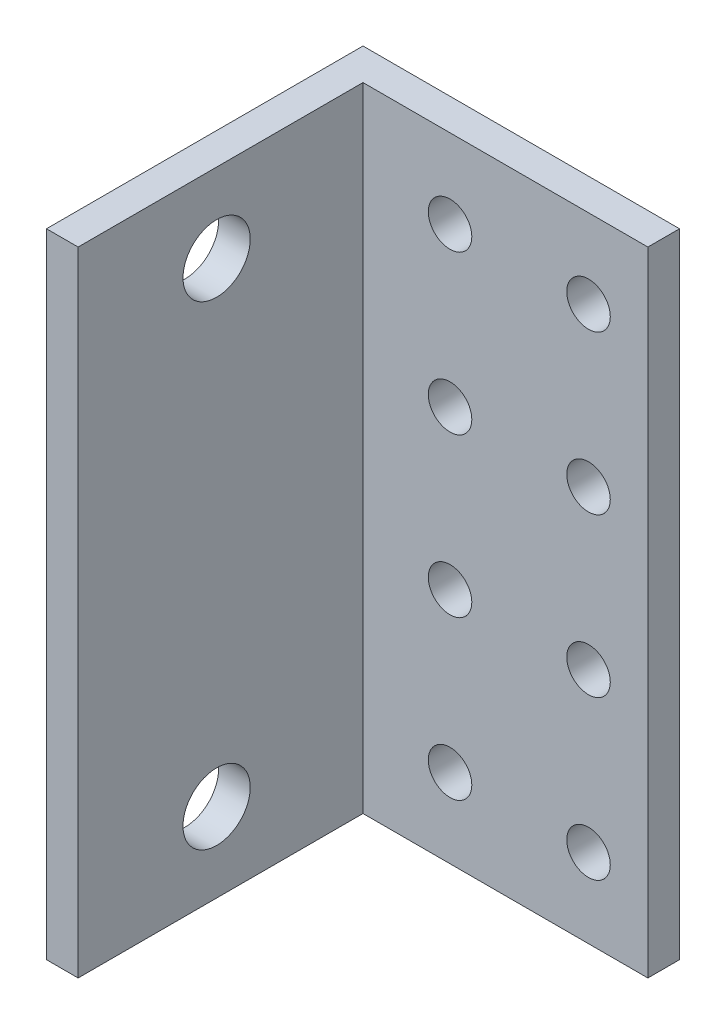
ISO-10303-21;
HEADER;
FILE_DESCRIPTION(('STEP AP214'),'2;1');
FILE_NAME('part.step','',(''),(''),'','','');
FILE_SCHEMA(('AUTOMOTIVE_DESIGN { 1 0 10303 214 1 1 1 1 }'));
ENDSEC;
DATA;
#1=APPLICATION_CONTEXT('core data for automotive mechanical design processes');
#2=APPLICATION_PROTOCOL_DEFINITION('international standard','automotive_design',2000,#1);
#3=PRODUCT_CONTEXT('',#1,'mechanical');
#4=PRODUCT('Part','Part','',(#3));
#5=PRODUCT_RELATED_PRODUCT_CATEGORY('part','',(#4));
#6=PRODUCT_DEFINITION_FORMATION('','',#4);
#7=PRODUCT_DEFINITION_CONTEXT('part definition',#1,'design');
#8=PRODUCT_DEFINITION('design','',#6,#7);
#9=PRODUCT_DEFINITION_SHAPE('','',#8);
#10=(LENGTH_UNIT() NAMED_UNIT(*) SI_UNIT(.MILLI.,.METRE.));
#11=(NAMED_UNIT(*) PLANE_ANGLE_UNIT() SI_UNIT($,.RADIAN.));
#12=(NAMED_UNIT(*) SI_UNIT($,.STERADIAN.) SOLID_ANGLE_UNIT());
#13=UNCERTAINTY_MEASURE_WITH_UNIT(LENGTH_MEASURE(1.E-05),#10,'distance_accuracy_value','');
#14=(GEOMETRIC_REPRESENTATION_CONTEXT(3) GLOBAL_UNCERTAINTY_ASSIGNED_CONTEXT((#13)) GLOBAL_UNIT_ASSIGNED_CONTEXT((#10,
#11,#12)) REPRESENTATION_CONTEXT('',''));
#15=CARTESIAN_POINT('',(0.,0.,0.));
#16=DIRECTION('',(0.,0.,1.));
#17=DIRECTION('',(1.,0.,0.));
#18=AXIS2_PLACEMENT_3D('',#15,#16,#17);
#19=CARTESIAN_POINT('',(4.,80.,4.));
#20=DIRECTION('',(-1.,0.,0.));
#21=DIRECTION('',(0.,0.,1.));
#22=AXIS2_PLACEMENT_3D('',#19,#20,#21);
#23=PLANE('',#22);
#24=DIRECTION('',(0.,0.,-1.));
#25=VECTOR('',#24,1.);
#26=CARTESIAN_POINT('',(4.,0.,4.));
#27=LINE('',#26,#25);
#28=CARTESIAN_POINT('',(4.,0.,40.));
#29=VERTEX_POINT('',#28);
#30=CARTESIAN_POINT('',(4.,0.,4.));
#31=VERTEX_POINT('',#30);
#32=EDGE_CURVE('E126',#29,#31,#27,.T.);
#33=ORIENTED_EDGE('',*,*,#32,.T.);
#34=DIRECTION('',(0.,-1.,0.));
#35=VECTOR('',#34,1.);
#36=CARTESIAN_POINT('',(4.,80.,4.));
#37=LINE('',#36,#35);
#38=CARTESIAN_POINT('',(4.,80.,4.));
#39=VERTEX_POINT('',#38);
#40=EDGE_CURVE('E111',#39,#31,#37,.T.);
#41=ORIENTED_EDGE('',*,*,#40,.F.);
#42=DIRECTION('',(0.,0.,-1.));
#43=VECTOR('',#42,1.);
#44=CARTESIAN_POINT('',(4.,80.,4.));
#45=LINE('',#44,#43);
#46=CARTESIAN_POINT('',(4.,80.,40.));
#47=VERTEX_POINT('',#46);
#48=EDGE_CURVE('E101',#47,#39,#45,.T.);
#49=ORIENTED_EDGE('',*,*,#48,.F.);
#50=DIRECTION('',(0.,-1.,0.));
#51=VECTOR('',#50,1.);
#52=CARTESIAN_POINT('',(4.,80.,40.));
#53=LINE('',#52,#51);
#54=EDGE_CURVE('E43',#47,#29,#53,.T.);
#55=ORIENTED_EDGE('',*,*,#54,.T.);
#56=EDGE_LOOP('',(#33,#41,#49,#55));
#57=FACE_BOUND('',#56,.T.);
#58=CARTESIAN_POINT('',(4.,9.99999999999999,22.5));
#59=DIRECTION('',(1.,0.,0.));
#60=DIRECTION('',(0.,0.,-1.));
#61=AXIS2_PLACEMENT_3D('',#58,#59,#60);
#62=CIRCLE('',#61,4.25);
#63=CARTESIAN_POINT('',(4.,9.99999999999999,18.25));
#64=VERTEX_POINT('',#63);
#65=EDGE_CURVE('E181',#64,#64,#62,.T.);
#66=ORIENTED_EDGE('',*,*,#65,.F.);
#67=EDGE_LOOP('',(#66));
#68=FACE_BOUND('',#67,.T.);
#69=CARTESIAN_POINT('',(4.,70.,22.5));
#70=DIRECTION('',(1.,0.,0.));
#71=DIRECTION('',(0.,0.,-1.));
#72=AXIS2_PLACEMENT_3D('',#69,#70,#71);
#73=CIRCLE('',#72,4.25);
#74=CARTESIAN_POINT('',(4.,70.,18.25));
#75=VERTEX_POINT('',#74);
#76=EDGE_CURVE('E392',#75,#75,#73,.T.);
#77=ORIENTED_EDGE('',*,*,#76,.F.);
#78=EDGE_LOOP('',(#77));
#79=FACE_BOUND('',#78,.T.);
#80=ADVANCED_FACE('F34',(#57,#68,#79),#23,.F.);
#81=CARTESIAN_POINT('',(40.,80.,4.));
#82=DIRECTION('',(0.,0.,-1.));
#83=DIRECTION('',(-1.,0.,0.));
#84=AXIS2_PLACEMENT_3D('',#81,#82,#83);
#85=PLANE('',#84);
#86=CARTESIAN_POINT('',(32.5,70.,4.));
#87=DIRECTION('',(0.,0.,1.));
#88=DIRECTION('',(1.,0.,0.));
#89=AXIS2_PLACEMENT_3D('',#86,#87,#88);
#90=CIRCLE('',#89,2.75);
#91=CARTESIAN_POINT('',(35.25,70.,4.));
#92=VERTEX_POINT('',#91);
#93=EDGE_CURVE('E180',#92,#92,#90,.T.);
#94=ORIENTED_EDGE('',*,*,#93,.F.);
#95=EDGE_LOOP('',(#94));
#96=FACE_BOUND('',#95,.T.);
#97=CARTESIAN_POINT('',(15.,70.,4.));
#98=DIRECTION('',(0.,0.,1.));
#99=DIRECTION('',(1.,0.,0.));
#100=AXIS2_PLACEMENT_3D('',#97,#98,#99);
#101=CIRCLE('',#100,2.75);
#102=CARTESIAN_POINT('',(17.75,70.,4.));
#103=VERTEX_POINT('',#102);
#104=EDGE_CURVE('E191',#103,#103,#101,.T.);
#105=ORIENTED_EDGE('',*,*,#104,.F.);
#106=EDGE_LOOP('',(#105));
#107=FACE_BOUND('',#106,.T.);
#108=DIRECTION('',(1.,0.,0.));
#109=VECTOR('',#108,1.);
#110=CARTESIAN_POINT('',(40.,0.,4.));
#111=LINE('',#110,#109);
#112=CARTESIAN_POINT('',(40.,0.,4.));
#113=VERTEX_POINT('',#112);
#114=EDGE_CURVE('E110',#31,#113,#111,.T.);
#115=ORIENTED_EDGE('',*,*,#114,.T.);
#116=DIRECTION('',(0.,-1.,0.));
#117=VECTOR('',#116,1.);
#118=CARTESIAN_POINT('',(40.,80.,4.));
#119=LINE('',#118,#117);
#120=CARTESIAN_POINT('',(40.,80.,4.));
#121=VERTEX_POINT('',#120);
#122=EDGE_CURVE('E106',#121,#113,#119,.T.);
#123=ORIENTED_EDGE('',*,*,#122,.F.);
#124=DIRECTION('',(1.,0.,0.));
#125=VECTOR('',#124,1.);
#126=CARTESIAN_POINT('',(40.,80.,4.));
#127=LINE('',#126,#125);
#128=EDGE_CURVE('E95',#39,#121,#127,.T.);
#129=ORIENTED_EDGE('',*,*,#128,.F.);
#130=ORIENTED_EDGE('',*,*,#40,.T.);
#131=EDGE_LOOP('',(#115,#123,#129,#130));
#132=FACE_BOUND('',#131,.T.);
#133=CARTESIAN_POINT('',(32.5,9.99999999999999,4.));
#134=DIRECTION('',(0.,0.,1.));
#135=DIRECTION('',(1.,0.,0.));
#136=AXIS2_PLACEMENT_3D('',#133,#134,#135);
#137=CIRCLE('',#136,2.75);
#138=CARTESIAN_POINT('',(35.25,9.99999999999999,4.));
#139=VERTEX_POINT('',#138);
#140=EDGE_CURVE('E227',#139,#139,#137,.T.);
#141=ORIENTED_EDGE('',*,*,#140,.F.);
#142=EDGE_LOOP('',(#141));
#143=FACE_BOUND('',#142,.T.);
#144=CARTESIAN_POINT('',(15.,9.99999999999999,4.));
#145=DIRECTION('',(0.,0.,1.));
#146=DIRECTION('',(1.,0.,0.));
#147=AXIS2_PLACEMENT_3D('',#144,#145,#146);
#148=CIRCLE('',#147,2.75);
#149=CARTESIAN_POINT('',(17.75,9.99999999999999,4.));
#150=VERTEX_POINT('',#149);
#151=EDGE_CURVE('E221',#150,#150,#148,.T.);
#152=ORIENTED_EDGE('',*,*,#151,.F.);
#153=EDGE_LOOP('',(#152));
#154=FACE_BOUND('',#153,.T.);
#155=CARTESIAN_POINT('',(15.,30.,4.));
#156=DIRECTION('',(0.,0.,1.));
#157=DIRECTION('',(1.,0.,0.));
#158=AXIS2_PLACEMENT_3D('',#155,#156,#157);
#159=CIRCLE('',#158,2.75);
#160=CARTESIAN_POINT('',(17.75,30.,4.));
#161=VERTEX_POINT('',#160);
#162=EDGE_CURVE('E215',#161,#161,#159,.T.);
#163=ORIENTED_EDGE('',*,*,#162,.F.);
#164=EDGE_LOOP('',(#163));
#165=FACE_BOUND('',#164,.T.);
#166=CARTESIAN_POINT('',(32.5,30.,4.));
#167=DIRECTION('',(0.,0.,1.));
#168=DIRECTION('',(1.,0.,0.));
#169=AXIS2_PLACEMENT_3D('',#166,#167,#168);
#170=CIRCLE('',#169,2.75);
#171=CARTESIAN_POINT('',(35.25,30.,4.));
#172=VERTEX_POINT('',#171);
#173=EDGE_CURVE('E209',#172,#172,#170,.T.);
#174=ORIENTED_EDGE('',*,*,#173,.F.);
#175=EDGE_LOOP('',(#174));
#176=FACE_BOUND('',#175,.T.);
#177=CARTESIAN_POINT('',(32.5,50.,4.));
#178=DIRECTION('',(0.,0.,1.));
#179=DIRECTION('',(1.,0.,0.));
#180=AXIS2_PLACEMENT_3D('',#177,#178,#179);
#181=CIRCLE('',#180,2.75);
#182=CARTESIAN_POINT('',(35.25,50.,4.));
#183=VERTEX_POINT('',#182);
#184=EDGE_CURVE('E203',#183,#183,#181,.T.);
#185=ORIENTED_EDGE('',*,*,#184,.F.);
#186=EDGE_LOOP('',(#185));
#187=FACE_BOUND('',#186,.T.);
#188=CARTESIAN_POINT('',(15.,50.,4.));
#189=DIRECTION('',(0.,0.,1.));
#190=DIRECTION('',(1.,0.,0.));
#191=AXIS2_PLACEMENT_3D('',#188,#189,#190);
#192=CIRCLE('',#191,2.75);
#193=CARTESIAN_POINT('',(17.75,50.,4.));
#194=VERTEX_POINT('',#193);
#195=EDGE_CURVE('E197',#194,#194,#192,.T.);
#196=ORIENTED_EDGE('',*,*,#195,.F.);
#197=EDGE_LOOP('',(#196));
#198=FACE_BOUND('',#197,.T.);
#199=ADVANCED_FACE('F107',(#96,#107,#132,#143,#154,#165,#176,#187,#198),#85,.F.);
#200=CARTESIAN_POINT('',(0.,80.,40.));
#201=DIRECTION('',(1.,0.,0.));
#202=DIRECTION('',(0.,0.,-1.));
#203=AXIS2_PLACEMENT_3D('',#200,#201,#202);
#204=PLANE('',#203);
#205=CARTESIAN_POINT('',(0.,70.,22.5));
#206=DIRECTION('',(1.,0.,0.));
#207=DIRECTION('',(0.,0.,-1.));
#208=AXIS2_PLACEMENT_3D('',#205,#206,#207);
#209=CIRCLE('',#208,4.25);
#210=CARTESIAN_POINT('',(0.,70.,18.25));
#211=VERTEX_POINT('',#210);
#212=EDGE_CURVE('E175',#211,#211,#209,.T.);
#213=ORIENTED_EDGE('',*,*,#212,.T.);
#214=EDGE_LOOP('',(#213));
#215=FACE_BOUND('',#214,.T.);
#216=CARTESIAN_POINT('',(0.,9.99999999999999,22.5));
#217=DIRECTION('',(1.,0.,0.));
#218=DIRECTION('',(0.,0.,-1.));
#219=AXIS2_PLACEMENT_3D('',#216,#217,#218);
#220=CIRCLE('',#219,4.25);
#221=CARTESIAN_POINT('',(0.,9.99999999999999,18.25));
#222=VERTEX_POINT('',#221);
#223=EDGE_CURVE('E178',#222,#222,#220,.T.);
#224=ORIENTED_EDGE('',*,*,#223,.T.);
#225=EDGE_LOOP('',(#224));
#226=FACE_BOUND('',#225,.T.);
#227=DIRECTION('',(0.,0.,1.));
#228=VECTOR('',#227,1.);
#229=CARTESIAN_POINT('',(0.,0.,40.));
#230=LINE('',#229,#228);
#231=CARTESIAN_POINT('',(0.,0.,0.));
#232=VERTEX_POINT('',#231);
#233=CARTESIAN_POINT('',(0.,0.,40.));
#234=VERTEX_POINT('',#233);
#235=EDGE_CURVE('E120',#232,#234,#230,.T.);
#236=ORIENTED_EDGE('',*,*,#235,.T.);
#237=DIRECTION('',(0.,-1.,0.));
#238=VECTOR('',#237,1.);
#239=CARTESIAN_POINT('',(0.,80.,40.));
#240=LINE('',#239,#238);
#241=CARTESIAN_POINT('',(0.,80.,40.));
#242=VERTEX_POINT('',#241);
#243=EDGE_CURVE('E11',#242,#234,#240,.T.);
#244=ORIENTED_EDGE('',*,*,#243,.F.);
#245=DIRECTION('',(0.,0.,1.));
#246=VECTOR('',#245,1.);
#247=CARTESIAN_POINT('',(0.,80.,40.));
#248=LINE('',#247,#246);
#249=CARTESIAN_POINT('',(0.,80.,0.));
#250=VERTEX_POINT('',#249);
#251=EDGE_CURVE('E131',#250,#242,#248,.T.);
#252=ORIENTED_EDGE('',*,*,#251,.F.);
#253=DIRECTION('',(0.,-1.,0.));
#254=VECTOR('',#253,1.);
#255=CARTESIAN_POINT('',(0.,80.,0.));
#256=LINE('',#255,#254);
#257=EDGE_CURVE('E116',#250,#232,#256,.T.);
#258=ORIENTED_EDGE('',*,*,#257,.T.);
#259=EDGE_LOOP('',(#236,#244,#252,#258));
#260=FACE_BOUND('',#259,.T.);
#261=ADVANCED_FACE('F36',(#215,#226,#260),#204,.F.);
#262=CARTESIAN_POINT('',(4.,80.,40.));
#263=DIRECTION('',(0.,0.,-1.));
#264=DIRECTION('',(-1.,0.,0.));
#265=AXIS2_PLACEMENT_3D('',#262,#263,#264);
#266=PLANE('',#265);
#267=DIRECTION('',(1.,0.,0.));
#268=VECTOR('',#267,1.);
#269=CARTESIAN_POINT('',(4.,0.,40.));
#270=LINE('',#269,#268);
#271=EDGE_CURVE('E123',#234,#29,#270,.T.);
#272=ORIENTED_EDGE('',*,*,#271,.T.);
#273=ORIENTED_EDGE('',*,*,#54,.F.);
#274=DIRECTION('',(1.,0.,0.));
#275=VECTOR('',#274,1.);
#276=CARTESIAN_POINT('',(4.,80.,40.));
#277=LINE('',#276,#275);
#278=EDGE_CURVE('E88',#242,#47,#277,.T.);
#279=ORIENTED_EDGE('',*,*,#278,.F.);
#280=ORIENTED_EDGE('',*,*,#243,.T.);
#281=EDGE_LOOP('',(#272,#273,#279,#280));
#282=FACE_BOUND('',#281,.T.);
#283=ADVANCED_FACE('F153',(#282),#266,.F.);
#284=CARTESIAN_POINT('',(40.,80.,0.));
#285=DIRECTION('',(-1.,0.,0.));
#286=DIRECTION('',(0.,0.,1.));
#287=AXIS2_PLACEMENT_3D('',#284,#285,#286);
#288=PLANE('',#287);
#289=DIRECTION('',(0.,0.,-1.));
#290=VECTOR('',#289,1.);
#291=CARTESIAN_POINT('',(40.,0.,0.));
#292=LINE('',#291,#290);
#293=CARTESIAN_POINT('',(40.,0.,0.));
#294=VERTEX_POINT('',#293);
#295=EDGE_CURVE('E74',#113,#294,#292,.T.);
#296=ORIENTED_EDGE('',*,*,#295,.T.);
#297=DIRECTION('',(0.,-1.,0.));
#298=VECTOR('',#297,1.);
#299=CARTESIAN_POINT('',(40.,80.,0.));
#300=LINE('',#299,#298);
#301=CARTESIAN_POINT('',(40.,80.,0.));
#302=VERTEX_POINT('',#301);
#303=EDGE_CURVE('E112',#302,#294,#300,.T.);
#304=ORIENTED_EDGE('',*,*,#303,.F.);
#305=DIRECTION('',(0.,0.,-1.));
#306=VECTOR('',#305,1.);
#307=CARTESIAN_POINT('',(40.,80.,0.));
#308=LINE('',#307,#306);
#309=EDGE_CURVE('E99',#121,#302,#308,.T.);
#310=ORIENTED_EDGE('',*,*,#309,.F.);
#311=ORIENTED_EDGE('',*,*,#122,.T.);
#312=EDGE_LOOP('',(#296,#304,#310,#311));
#313=FACE_BOUND('',#312,.T.);
#314=ADVANCED_FACE('F114',(#313),#288,.F.);
#315=CARTESIAN_POINT('',(0.,80.,0.));
#316=DIRECTION('',(0.,0.,1.));
#317=DIRECTION('',(1.,0.,0.));
#318=AXIS2_PLACEMENT_3D('',#315,#316,#317);
#319=PLANE('',#318);
#320=CARTESIAN_POINT('',(32.5,70.,0.));
#321=DIRECTION('',(0.,0.,1.));
#322=DIRECTION('',(1.,0.,0.));
#323=AXIS2_PLACEMENT_3D('',#320,#321,#322);
#324=CIRCLE('',#323,2.75);
#325=CARTESIAN_POINT('',(35.25,70.,0.));
#326=VERTEX_POINT('',#325);
#327=EDGE_CURVE('E184',#326,#326,#324,.T.);
#328=ORIENTED_EDGE('',*,*,#327,.T.);
#329=EDGE_LOOP('',(#328));
#330=FACE_BOUND('',#329,.T.);
#331=CARTESIAN_POINT('',(15.,70.,0.));
#332=DIRECTION('',(0.,0.,1.));
#333=DIRECTION('',(1.,0.,0.));
#334=AXIS2_PLACEMENT_3D('',#331,#332,#333);
#335=CIRCLE('',#334,2.75);
#336=CARTESIAN_POINT('',(17.75,70.,0.));
#337=VERTEX_POINT('',#336);
#338=EDGE_CURVE('E194',#337,#337,#335,.T.);
#339=ORIENTED_EDGE('',*,*,#338,.T.);
#340=EDGE_LOOP('',(#339));
#341=FACE_BOUND('',#340,.T.);
#342=CARTESIAN_POINT('',(15.,50.,0.));
#343=DIRECTION('',(0.,0.,1.));
#344=DIRECTION('',(1.,0.,0.));
#345=AXIS2_PLACEMENT_3D('',#342,#343,#344);
#346=CIRCLE('',#345,2.75);
#347=CARTESIAN_POINT('',(17.75,50.,0.));
#348=VERTEX_POINT('',#347);
#349=EDGE_CURVE('E200',#348,#348,#346,.T.);
#350=ORIENTED_EDGE('',*,*,#349,.T.);
#351=EDGE_LOOP('',(#350));
#352=FACE_BOUND('',#351,.T.);
#353=CARTESIAN_POINT('',(32.5,50.,0.));
#354=DIRECTION('',(0.,0.,1.));
#355=DIRECTION('',(1.,0.,0.));
#356=AXIS2_PLACEMENT_3D('',#353,#354,#355);
#357=CIRCLE('',#356,2.75);
#358=CARTESIAN_POINT('',(35.25,50.,0.));
#359=VERTEX_POINT('',#358);
#360=EDGE_CURVE('E206',#359,#359,#357,.T.);
#361=ORIENTED_EDGE('',*,*,#360,.T.);
#362=EDGE_LOOP('',(#361));
#363=FACE_BOUND('',#362,.T.);
#364=CARTESIAN_POINT('',(32.5,30.,0.));
#365=DIRECTION('',(0.,0.,1.));
#366=DIRECTION('',(1.,0.,0.));
#367=AXIS2_PLACEMENT_3D('',#364,#365,#366);
#368=CIRCLE('',#367,2.75);
#369=CARTESIAN_POINT('',(35.25,30.,0.));
#370=VERTEX_POINT('',#369);
#371=EDGE_CURVE('E212',#370,#370,#368,.T.);
#372=ORIENTED_EDGE('',*,*,#371,.T.);
#373=EDGE_LOOP('',(#372));
#374=FACE_BOUND('',#373,.T.);
#375=CARTESIAN_POINT('',(15.,30.,0.));
#376=DIRECTION('',(0.,0.,1.));
#377=DIRECTION('',(1.,0.,0.));
#378=AXIS2_PLACEMENT_3D('',#375,#376,#377);
#379=CIRCLE('',#378,2.75);
#380=CARTESIAN_POINT('',(17.75,30.,0.));
#381=VERTEX_POINT('',#380);
#382=EDGE_CURVE('E218',#381,#381,#379,.T.);
#383=ORIENTED_EDGE('',*,*,#382,.T.);
#384=EDGE_LOOP('',(#383));
#385=FACE_BOUND('',#384,.T.);
#386=CARTESIAN_POINT('',(15.,9.99999999999999,0.));
#387=DIRECTION('',(0.,0.,1.));
#388=DIRECTION('',(1.,0.,0.));
#389=AXIS2_PLACEMENT_3D('',#386,#387,#388);
#390=CIRCLE('',#389,2.75);
#391=CARTESIAN_POINT('',(17.75,9.99999999999999,0.));
#392=VERTEX_POINT('',#391);
#393=EDGE_CURVE('E224',#392,#392,#390,.T.);
#394=ORIENTED_EDGE('',*,*,#393,.T.);
#395=EDGE_LOOP('',(#394));
#396=FACE_BOUND('',#395,.T.);
#397=CARTESIAN_POINT('',(32.5,9.99999999999999,0.));
#398=DIRECTION('',(0.,0.,1.));
#399=DIRECTION('',(1.,0.,0.));
#400=AXIS2_PLACEMENT_3D('',#397,#398,#399);
#401=CIRCLE('',#400,2.75);
#402=CARTESIAN_POINT('',(35.25,9.99999999999999,0.));
#403=VERTEX_POINT('',#402);
#404=EDGE_CURVE('E124',#403,#403,#401,.T.);
#405=ORIENTED_EDGE('',*,*,#404,.T.);
#406=EDGE_LOOP('',(#405));
#407=FACE_BOUND('',#406,.T.);
#408=DIRECTION('',(-1.,0.,0.));
#409=VECTOR('',#408,1.);
#410=CARTESIAN_POINT('',(0.,0.,0.));
#411=LINE('',#410,#409);
#412=EDGE_CURVE('E80',#294,#232,#411,.T.);
#413=ORIENTED_EDGE('',*,*,#412,.T.);
#414=ORIENTED_EDGE('',*,*,#257,.F.);
#415=DIRECTION('',(-1.,0.,0.));
#416=VECTOR('',#415,1.);
#417=CARTESIAN_POINT('',(0.,80.,0.));
#418=LINE('',#417,#416);
#419=EDGE_CURVE('E51',#302,#250,#418,.T.);
#420=ORIENTED_EDGE('',*,*,#419,.F.);
#421=ORIENTED_EDGE('',*,*,#303,.T.);
#422=EDGE_LOOP('',(#413,#414,#420,#421));
#423=FACE_BOUND('',#422,.T.);
#424=ADVANCED_FACE('F144',(#330,#341,#352,#363,#374,#385,#396,#407,#423),#319,.F.);
#425=CARTESIAN_POINT('',(0.,80.,0.));
#426=DIRECTION('',(0.,-1.,0.));
#427=DIRECTION('',(0.,0.,-1.));
#428=AXIS2_PLACEMENT_3D('',#425,#426,#427);
#429=PLANE('',#428);
#430=ORIENTED_EDGE('',*,*,#251,.T.);
#431=ORIENTED_EDGE('',*,*,#278,.T.);
#432=ORIENTED_EDGE('',*,*,#48,.T.);
#433=ORIENTED_EDGE('',*,*,#128,.T.);
#434=ORIENTED_EDGE('',*,*,#309,.T.);
#435=ORIENTED_EDGE('',*,*,#419,.T.);
#436=EDGE_LOOP('',(#430,#431,#432,#433,#434,#435));
#437=FACE_BOUND('',#436,.T.);
#438=ADVANCED_FACE('F97',(#437),#429,.F.);
#439=CARTESIAN_POINT('',(0.,0.,0.));
#440=DIRECTION('',(0.,-1.,0.));
#441=DIRECTION('',(0.,0.,-1.));
#442=AXIS2_PLACEMENT_3D('',#439,#440,#441);
#443=PLANE('',#442);
#444=ORIENTED_EDGE('',*,*,#235,.F.);
#445=ORIENTED_EDGE('',*,*,#412,.F.);
#446=ORIENTED_EDGE('',*,*,#295,.F.);
#447=ORIENTED_EDGE('',*,*,#114,.F.);
#448=ORIENTED_EDGE('',*,*,#32,.F.);
#449=ORIENTED_EDGE('',*,*,#271,.F.);
#450=EDGE_LOOP('',(#444,#445,#446,#447,#448,#449));
#451=FACE_BOUND('',#450,.T.);
#452=ADVANCED_FACE('F140',(#451),#443,.T.);
#453=CARTESIAN_POINT('',(32.5,9.99999999999999,4.));
#454=DIRECTION('',(0.,0.,1.));
#455=DIRECTION('',(1.,0.,0.));
#456=AXIS2_PLACEMENT_3D('',#453,#454,#455);
#457=CYLINDRICAL_SURFACE('',#456,2.75);
#458=ORIENTED_EDGE('',*,*,#404,.F.);
#459=EDGE_LOOP('',(#458));
#460=FACE_BOUND('',#459,.T.);
#461=ORIENTED_EDGE('',*,*,#140,.T.);
#462=EDGE_LOOP('',(#461));
#463=FACE_BOUND('',#462,.T.);
#464=ADVANCED_FACE('F236',(#460,#463),#457,.F.);
#465=CARTESIAN_POINT('',(15.,9.99999999999999,4.));
#466=DIRECTION('',(0.,0.,1.));
#467=DIRECTION('',(1.,0.,0.));
#468=AXIS2_PLACEMENT_3D('',#465,#466,#467);
#469=CYLINDRICAL_SURFACE('',#468,2.75);
#470=ORIENTED_EDGE('',*,*,#393,.F.);
#471=EDGE_LOOP('',(#470));
#472=FACE_BOUND('',#471,.T.);
#473=ORIENTED_EDGE('',*,*,#151,.T.);
#474=EDGE_LOOP('',(#473));
#475=FACE_BOUND('',#474,.T.);
#476=ADVANCED_FACE('F239',(#472,#475),#469,.F.);
#477=CARTESIAN_POINT('',(15.,30.,4.));
#478=DIRECTION('',(0.,0.,1.));
#479=DIRECTION('',(1.,0.,0.));
#480=AXIS2_PLACEMENT_3D('',#477,#478,#479);
#481=CYLINDRICAL_SURFACE('',#480,2.75);
#482=ORIENTED_EDGE('',*,*,#382,.F.);
#483=EDGE_LOOP('',(#482));
#484=FACE_BOUND('',#483,.T.);
#485=ORIENTED_EDGE('',*,*,#162,.T.);
#486=EDGE_LOOP('',(#485));
#487=FACE_BOUND('',#486,.T.);
#488=ADVANCED_FACE('F274',(#484,#487),#481,.F.);
#489=CARTESIAN_POINT('',(32.5,30.,4.));
#490=DIRECTION('',(0.,0.,1.));
#491=DIRECTION('',(1.,0.,0.));
#492=AXIS2_PLACEMENT_3D('',#489,#490,#491);
#493=CYLINDRICAL_SURFACE('',#492,2.75);
#494=ORIENTED_EDGE('',*,*,#371,.F.);
#495=EDGE_LOOP('',(#494));
#496=FACE_BOUND('',#495,.T.);
#497=ORIENTED_EDGE('',*,*,#173,.T.);
#498=EDGE_LOOP('',(#497));
#499=FACE_BOUND('',#498,.T.);
#500=ADVANCED_FACE('F266',(#496,#499),#493,.F.);
#501=CARTESIAN_POINT('',(32.5,50.,4.));
#502=DIRECTION('',(0.,0.,1.));
#503=DIRECTION('',(1.,0.,0.));
#504=AXIS2_PLACEMENT_3D('',#501,#502,#503);
#505=CYLINDRICAL_SURFACE('',#504,2.75);
#506=ORIENTED_EDGE('',*,*,#360,.F.);
#507=EDGE_LOOP('',(#506));
#508=FACE_BOUND('',#507,.T.);
#509=ORIENTED_EDGE('',*,*,#184,.T.);
#510=EDGE_LOOP('',(#509));
#511=FACE_BOUND('',#510,.T.);
#512=ADVANCED_FACE('F256',(#508,#511),#505,.F.);
#513=CARTESIAN_POINT('',(15.,50.,4.));
#514=DIRECTION('',(0.,0.,1.));
#515=DIRECTION('',(1.,0.,0.));
#516=AXIS2_PLACEMENT_3D('',#513,#514,#515);
#517=CYLINDRICAL_SURFACE('',#516,2.75);
#518=ORIENTED_EDGE('',*,*,#349,.F.);
#519=EDGE_LOOP('',(#518));
#520=FACE_BOUND('',#519,.T.);
#521=ORIENTED_EDGE('',*,*,#195,.T.);
#522=EDGE_LOOP('',(#521));
#523=FACE_BOUND('',#522,.T.);
#524=ADVANCED_FACE('F253',(#520,#523),#517,.F.);
#525=CARTESIAN_POINT('',(15.,70.,4.));
#526=DIRECTION('',(0.,0.,1.));
#527=DIRECTION('',(1.,0.,0.));
#528=AXIS2_PLACEMENT_3D('',#525,#526,#527);
#529=CYLINDRICAL_SURFACE('',#528,2.75);
#530=ORIENTED_EDGE('',*,*,#338,.F.);
#531=EDGE_LOOP('',(#530));
#532=FACE_BOUND('',#531,.T.);
#533=ORIENTED_EDGE('',*,*,#104,.T.);
#534=EDGE_LOOP('',(#533));
#535=FACE_BOUND('',#534,.T.);
#536=ADVANCED_FACE('F255',(#532,#535),#529,.F.);
#537=CARTESIAN_POINT('',(32.5,70.,4.));
#538=DIRECTION('',(0.,0.,1.));
#539=DIRECTION('',(1.,0.,0.));
#540=AXIS2_PLACEMENT_3D('',#537,#538,#539);
#541=CYLINDRICAL_SURFACE('',#540,2.75);
#542=ORIENTED_EDGE('',*,*,#327,.F.);
#543=EDGE_LOOP('',(#542));
#544=FACE_BOUND('',#543,.T.);
#545=ORIENTED_EDGE('',*,*,#93,.T.);
#546=EDGE_LOOP('',(#545));
#547=FACE_BOUND('',#546,.T.);
#548=ADVANCED_FACE('F263',(#544,#547),#541,.F.);
#549=CARTESIAN_POINT('',(4.,9.99999999999999,22.5));
#550=DIRECTION('',(1.,0.,0.));
#551=DIRECTION('',(0.,0.,-1.));
#552=AXIS2_PLACEMENT_3D('',#549,#550,#551);
#553=CYLINDRICAL_SURFACE('',#552,4.25);
#554=ORIENTED_EDGE('',*,*,#223,.F.);
#555=EDGE_LOOP('',(#554));
#556=FACE_BOUND('',#555,.T.);
#557=ORIENTED_EDGE('',*,*,#65,.T.);
#558=EDGE_LOOP('',(#557));
#559=FACE_BOUND('',#558,.T.);
#560=ADVANCED_FACE('F362',(#556,#559),#553,.F.);
#561=CARTESIAN_POINT('',(4.,70.,22.5));
#562=DIRECTION('',(1.,0.,0.));
#563=DIRECTION('',(0.,0.,-1.));
#564=AXIS2_PLACEMENT_3D('',#561,#562,#563);
#565=CYLINDRICAL_SURFACE('',#564,4.25);
#566=ORIENTED_EDGE('',*,*,#212,.F.);
#567=EDGE_LOOP('',(#566));
#568=FACE_BOUND('',#567,.T.);
#569=ORIENTED_EDGE('',*,*,#76,.T.);
#570=EDGE_LOOP('',(#569));
#571=FACE_BOUND('',#570,.T.);
#572=ADVANCED_FACE('F370',(#568,#571),#565,.F.);
#573=CLOSED_SHELL('',(#80,#199,#261,#283,#314,#424,#438,#452,#464,#476,#488,#500,#512,#524,#536,
#548,#560,#572));
#574=MANIFOLD_SOLID_BREP('B2',#573);
#575=ADVANCED_BREP_SHAPE_REPRESENTATION('',(#18,#574),#14);
#576=SHAPE_DEFINITION_REPRESENTATION(#9,#575);
ENDSEC;
END-ISO-10303-21;
